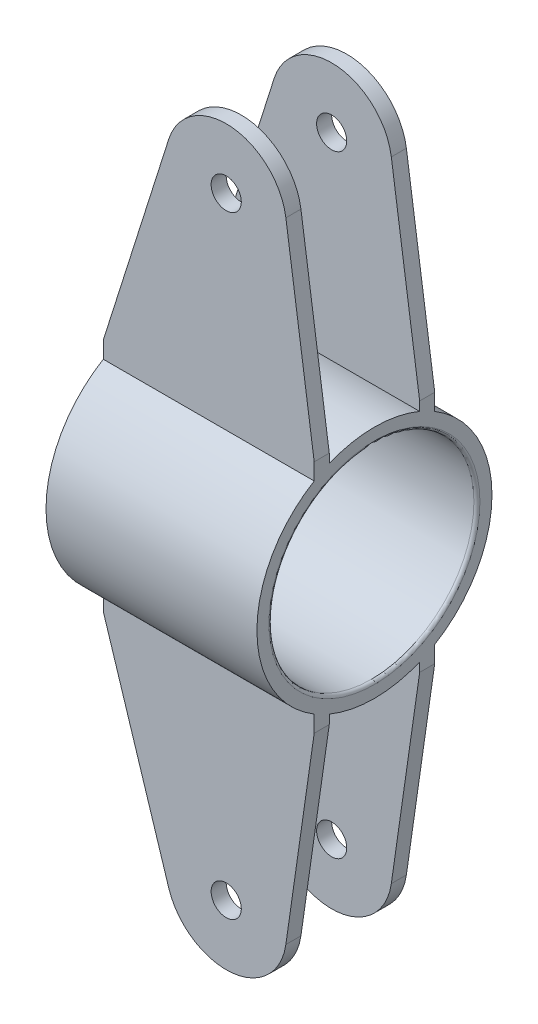
ISO-10303-21;
HEADER;
FILE_DESCRIPTION(('STEP AP214'),'2;1');
FILE_NAME('part.step','',(''),(''),'','','');
FILE_SCHEMA(('AUTOMOTIVE_DESIGN { 1 0 10303 214 1 1 1 1 }'));
ENDSEC;
DATA;
#1=APPLICATION_CONTEXT('core data for automotive mechanical design processes');
#2=APPLICATION_PROTOCOL_DEFINITION('international standard','automotive_design',2000,#1);
#3=PRODUCT_CONTEXT('',#1,'mechanical');
#4=PRODUCT('Part','Part','',(#3));
#5=PRODUCT_RELATED_PRODUCT_CATEGORY('part','',(#4));
#6=PRODUCT_DEFINITION_FORMATION('','',#4);
#7=PRODUCT_DEFINITION_CONTEXT('part definition',#1,'design');
#8=PRODUCT_DEFINITION('design','',#6,#7);
#9=PRODUCT_DEFINITION_SHAPE('','',#8);
#10=(LENGTH_UNIT() NAMED_UNIT(*) SI_UNIT(.MILLI.,.METRE.));
#11=(NAMED_UNIT(*) PLANE_ANGLE_UNIT() SI_UNIT($,.RADIAN.));
#12=(NAMED_UNIT(*) SI_UNIT($,.STERADIAN.) SOLID_ANGLE_UNIT());
#13=UNCERTAINTY_MEASURE_WITH_UNIT(LENGTH_MEASURE(1.E-05),#10,'distance_accuracy_value','');
#14=(GEOMETRIC_REPRESENTATION_CONTEXT(3) GLOBAL_UNCERTAINTY_ASSIGNED_CONTEXT((#13)) GLOBAL_UNIT_ASSIGNED_CONTEXT((#10,
#11,#12)) REPRESENTATION_CONTEXT('',''));
#15=CARTESIAN_POINT('',(0.,0.,0.));
#16=DIRECTION('',(0.,0.,1.));
#17=DIRECTION('',(1.,0.,0.));
#18=AXIS2_PLACEMENT_3D('',#15,#16,#17);
#19=CARTESIAN_POINT('',(35.,0.,0.));
#20=DIRECTION('',(-1.,0.,0.));
#21=DIRECTION('',(0.,0.,1.));
#22=AXIS2_PLACEMENT_3D('',#19,#20,#21);
#23=CYLINDRICAL_SURFACE('',#22,39.007);
#24=CARTESIAN_POINT('',(-21.9,0.,0.));
#25=DIRECTION('',(1.,0.,0.));
#26=DIRECTION('',(0.,0.,1.));
#27=AXIS2_PLACEMENT_3D('',#24,#25,#26);
#28=CIRCLE('',#27,39.007);
#29=CARTESIAN_POINT('',(-21.9,0.,-39.007));
#30=VERTEX_POINT('',#29);
#31=CARTESIAN_POINT('',(-21.9,33.4894916205069,-20.));
#32=VERTEX_POINT('',#31);
#33=EDGE_CURVE('E237',#30,#32,#28,.T.);
#34=ORIENTED_EDGE('',*,*,#33,.T.);
#35=DIRECTION('',(1.,0.,0.));
#36=VECTOR('',#35,1.);
#37=CARTESIAN_POINT('',(-42.4459988394961,33.4894916205069,-20.));
#38=LINE('',#37,#36);
#39=CARTESIAN_POINT('',(35.,33.4894916205069,-20.));
#40=VERTEX_POINT('',#39);
#41=EDGE_CURVE('E223',#32,#40,#38,.T.);
#42=ORIENTED_EDGE('',*,*,#41,.T.);
#43=CARTESIAN_POINT('',(35.,0.,0.));
#44=DIRECTION('',(1.,0.,0.));
#45=DIRECTION('',(0.,0.,-1.));
#46=AXIS2_PLACEMENT_3D('',#43,#44,#45);
#47=CIRCLE('',#46,39.007);
#48=CARTESIAN_POINT('',(35.,-33.4894916205069,-20.));
#49=VERTEX_POINT('',#48);
#50=EDGE_CURVE('E553',#49,#40,#47,.T.);
#51=ORIENTED_EDGE('',*,*,#50,.F.);
#52=DIRECTION('',(1.,0.,0.));
#53=VECTOR('',#52,1.);
#54=CARTESIAN_POINT('',(-42.4459988394961,-33.4894916205069,-20.));
#55=LINE('',#54,#53);
#56=CARTESIAN_POINT('',(-35.,-33.4894916205069,-20.));
#57=VERTEX_POINT('',#56);
#58=EDGE_CURVE('E546',#57,#49,#55,.T.);
#59=ORIENTED_EDGE('',*,*,#58,.F.);
#60=CARTESIAN_POINT('',(-35.,0.,0.));
#61=DIRECTION('',(1.,0.,0.));
#62=DIRECTION('',(0.,0.,-1.));
#63=AXIS2_PLACEMENT_3D('',#60,#61,#62);
#64=CIRCLE('',#63,39.007);
#65=CARTESIAN_POINT('',(-35.,33.4894916205069,-20.));
#66=VERTEX_POINT('',#65);
#67=EDGE_CURVE('E559',#57,#66,#64,.T.);
#68=ORIENTED_EDGE('',*,*,#67,.T.);
#69=CARTESIAN_POINT('',(-25.9,33.4894916205069,-20.));
#70=VERTEX_POINT('',#69);
#71=EDGE_CURVE('E234',#66,#70,#38,.T.);
#72=ORIENTED_EDGE('',*,*,#71,.T.);
#73=CARTESIAN_POINT('',(-25.9,0.,0.));
#74=DIRECTION('',(1.,0.,0.));
#75=DIRECTION('',(0.,0.,1.));
#76=AXIS2_PLACEMENT_3D('',#73,#74,#75);
#77=CIRCLE('',#76,39.007);
#78=CARTESIAN_POINT('',(-25.9,0.,-39.007));
#79=VERTEX_POINT('',#78);
#80=EDGE_CURVE('E59',#79,#70,#77,.T.);
#81=ORIENTED_EDGE('',*,*,#80,.F.);
#82=DIRECTION('',(-1.,0.,0.));
#83=VECTOR('',#82,1.);
#84=CARTESIAN_POINT('',(-21.9,0.,-39.007));
#85=LINE('',#84,#83);
#86=EDGE_CURVE('E54',#30,#79,#85,.T.);
#87=ORIENTED_EDGE('',*,*,#86,.F.);
#88=EDGE_LOOP('',(#34,#42,#51,#59,#68,#72,#81,#87));
#89=FACE_BOUND('',#88,.T.);
#90=ADVANCED_FACE('F38',(#89),#23,.T.);
#91=CARTESIAN_POINT('',(35.,33.4894916205069,20.));
#92=VERTEX_POINT('',#91);
#93=CARTESIAN_POINT('',(35.,-33.4894916205069,20.));
#94=VERTEX_POINT('',#93);
#95=EDGE_CURVE('E622',#92,#94,#47,.T.);
#96=ORIENTED_EDGE('',*,*,#95,.F.);
#97=DIRECTION('',(1.,0.,0.));
#98=VECTOR('',#97,1.);
#99=CARTESIAN_POINT('',(-42.4459988394961,33.4894916205069,20.));
#100=LINE('',#99,#98);
#101=CARTESIAN_POINT('',(-35.,33.4894916205069,20.));
#102=VERTEX_POINT('',#101);
#103=EDGE_CURVE('E410',#102,#92,#100,.T.);
#104=ORIENTED_EDGE('',*,*,#103,.F.);
#105=CARTESIAN_POINT('',(-35.,-33.4894916205069,20.));
#106=VERTEX_POINT('',#105);
#107=EDGE_CURVE('E661',#102,#106,#64,.T.);
#108=ORIENTED_EDGE('',*,*,#107,.T.);
#109=DIRECTION('',(1.,0.,0.));
#110=VECTOR('',#109,1.);
#111=CARTESIAN_POINT('',(-42.4459988394961,-33.4894916205069,20.));
#112=LINE('',#111,#110);
#113=EDGE_CURVE('E458',#106,#94,#112,.T.);
#114=ORIENTED_EDGE('',*,*,#113,.T.);
#115=EDGE_LOOP('',(#96,#104,#108,#114));
#116=FACE_BOUND('',#115,.T.);
#117=ADVANCED_FACE('F586',(#116),#23,.T.);
#118=CARTESIAN_POINT('',(35.,36.0075832152062,-15.));
#119=VERTEX_POINT('',#118);
#120=CARTESIAN_POINT('',(35.,36.0075832152062,15.));
#121=VERTEX_POINT('',#120);
#122=EDGE_CURVE('E557',#119,#121,#47,.T.);
#123=ORIENTED_EDGE('',*,*,#122,.F.);
#124=DIRECTION('',(1.,0.,0.));
#125=VECTOR('',#124,1.);
#126=CARTESIAN_POINT('',(-42.4459988394961,36.0075832152062,-15.));
#127=LINE('',#126,#125);
#128=CARTESIAN_POINT('',(-35.,36.0075832152062,-15.));
#129=VERTEX_POINT('',#128);
#130=EDGE_CURVE('E235',#129,#119,#127,.T.);
#131=ORIENTED_EDGE('',*,*,#130,.F.);
#132=CARTESIAN_POINT('',(-35.,36.0075832152062,15.));
#133=VERTEX_POINT('',#132);
#134=EDGE_CURVE('E562',#129,#133,#64,.T.);
#135=ORIENTED_EDGE('',*,*,#134,.T.);
#136=DIRECTION('',(1.,0.,0.));
#137=VECTOR('',#136,1.);
#138=CARTESIAN_POINT('',(-42.4459988394961,36.0075832152062,15.));
#139=LINE('',#138,#137);
#140=EDGE_CURVE('E390',#133,#121,#139,.T.);
#141=ORIENTED_EDGE('',*,*,#140,.T.);
#142=EDGE_LOOP('',(#123,#131,#135,#141));
#143=FACE_BOUND('',#142,.T.);
#144=ADVANCED_FACE('F592',(#143),#23,.T.);
#145=CARTESIAN_POINT('',(35.,0.,0.));
#146=DIRECTION('',(1.,0.,0.));
#147=DIRECTION('',(0.,0.,-1.));
#148=AXIS2_PLACEMENT_3D('',#145,#146,#147);
#149=PLANE('',#148);
#150=CARTESIAN_POINT('',(35.,0.,0.));
#151=DIRECTION('',(1.,0.,0.));
#152=DIRECTION('',(0.,0.,-1.));
#153=AXIS2_PLACEMENT_3D('',#150,#151,#152);
#154=CIRCLE('',#153,35.007);
#155=CARTESIAN_POINT('',(35.,0.,-35.007));
#156=VERTEX_POINT('',#155);
#157=EDGE_CURVE('E566',#156,#156,#154,.F.);
#158=ORIENTED_EDGE('',*,*,#157,.T.);
#159=EDGE_LOOP('',(#158));
#160=FACE_BOUND('',#159,.T.);
#161=ORIENTED_EDGE('',*,*,#50,.T.);
#162=DIRECTION('',(0.,1.,0.));
#163=VECTOR('',#162,1.);
#164=CARTESIAN_POINT('',(35.,39.007,-20.));
#165=LINE('',#164,#163);
#166=CARTESIAN_POINT('',(35.,39.007,-20.));
#167=VERTEX_POINT('',#166);
#168=EDGE_CURVE('E231',#40,#167,#165,.T.);
#169=ORIENTED_EDGE('',*,*,#168,.T.);
#170=DIRECTION('',(0.,0.,1.));
#171=VECTOR('',#170,1.);
#172=CARTESIAN_POINT('',(35.,39.007,-20.));
#173=LINE('',#172,#171);
#174=CARTESIAN_POINT('',(35.,39.007,-15.));
#175=VERTEX_POINT('',#174);
#176=EDGE_CURVE('E335',#167,#175,#173,.T.);
#177=ORIENTED_EDGE('',*,*,#176,.T.);
#178=DIRECTION('',(0.,-1.,0.));
#179=VECTOR('',#178,1.);
#180=CARTESIAN_POINT('',(35.,39.007,-15.));
#181=LINE('',#180,#179);
#182=EDGE_CURVE('E338',#175,#119,#181,.T.);
#183=ORIENTED_EDGE('',*,*,#182,.T.);
#184=ORIENTED_EDGE('',*,*,#122,.T.);
#185=DIRECTION('',(0.,1.,0.));
#186=VECTOR('',#185,1.);
#187=CARTESIAN_POINT('',(35.,39.007,15.));
#188=LINE('',#187,#186);
#189=CARTESIAN_POINT('',(35.,39.007,15.));
#190=VERTEX_POINT('',#189);
#191=EDGE_CURVE('E402',#121,#190,#188,.T.);
#192=ORIENTED_EDGE('',*,*,#191,.T.);
#193=DIRECTION('',(0.,0.,1.));
#194=VECTOR('',#193,1.);
#195=CARTESIAN_POINT('',(35.,39.007,20.));
#196=LINE('',#195,#194);
#197=CARTESIAN_POINT('',(35.,39.007,20.));
#198=VERTEX_POINT('',#197);
#199=EDGE_CURVE('E406',#190,#198,#196,.T.);
#200=ORIENTED_EDGE('',*,*,#199,.T.);
#201=DIRECTION('',(0.,-1.,0.));
#202=VECTOR('',#201,1.);
#203=CARTESIAN_POINT('',(35.,39.007,20.));
#204=LINE('',#203,#202);
#205=EDGE_CURVE('E384',#198,#92,#204,.T.);
#206=ORIENTED_EDGE('',*,*,#205,.T.);
#207=ORIENTED_EDGE('',*,*,#95,.T.);
#208=DIRECTION('',(0.,-1.,0.));
#209=VECTOR('',#208,1.);
#210=CARTESIAN_POINT('',(35.,-39.007,20.));
#211=LINE('',#210,#209);
#212=CARTESIAN_POINT('',(35.,-39.007,20.));
#213=VERTEX_POINT('',#212);
#214=EDGE_CURVE('E452',#94,#213,#211,.T.);
#215=ORIENTED_EDGE('',*,*,#214,.T.);
#216=DIRECTION('',(0.,0.,-1.));
#217=VECTOR('',#216,1.);
#218=CARTESIAN_POINT('',(35.,-39.007,20.));
#219=LINE('',#218,#217);
#220=CARTESIAN_POINT('',(35.,-39.007,15.));
#221=VERTEX_POINT('',#220);
#222=EDGE_CURVE('E466',#213,#221,#219,.T.);
#223=ORIENTED_EDGE('',*,*,#222,.T.);
#224=DIRECTION('',(0.,1.,0.));
#225=VECTOR('',#224,1.);
#226=CARTESIAN_POINT('',(35.,-39.007,15.));
#227=LINE('',#226,#225);
#228=CARTESIAN_POINT('',(35.,-36.0075832152062,15.));
#229=VERTEX_POINT('',#228);
#230=EDGE_CURVE('E470',#221,#229,#227,.T.);
#231=ORIENTED_EDGE('',*,*,#230,.T.);
#232=CARTESIAN_POINT('',(35.,-36.0075832152062,-15.));
#233=VERTEX_POINT('',#232);
#234=EDGE_CURVE('E558',#229,#233,#47,.T.);
#235=ORIENTED_EDGE('',*,*,#234,.T.);
#236=DIRECTION('',(0.,-1.,0.));
#237=VECTOR('',#236,1.);
#238=CARTESIAN_POINT('',(35.,-39.007,-15.));
#239=LINE('',#238,#237);
#240=CARTESIAN_POINT('',(35.,-39.007,-15.));
#241=VERTEX_POINT('',#240);
#242=EDGE_CURVE('E538',#233,#241,#239,.T.);
#243=ORIENTED_EDGE('',*,*,#242,.T.);
#244=DIRECTION('',(0.,0.,-1.));
#245=VECTOR('',#244,1.);
#246=CARTESIAN_POINT('',(35.,-39.007,-20.));
#247=LINE('',#246,#245);
#248=CARTESIAN_POINT('',(35.,-39.007,-20.));
#249=VERTEX_POINT('',#248);
#250=EDGE_CURVE('E542',#241,#249,#247,.T.);
#251=ORIENTED_EDGE('',*,*,#250,.T.);
#252=DIRECTION('',(0.,1.,0.));
#253=VECTOR('',#252,1.);
#254=CARTESIAN_POINT('',(35.,-39.007,-20.));
#255=LINE('',#254,#253);
#256=EDGE_CURVE('E518',#249,#49,#255,.T.);
#257=ORIENTED_EDGE('',*,*,#256,.T.);
#258=EDGE_LOOP('',(#161,#169,#177,#183,#184,#192,#200,#206,#207,#215,#223,#231,#235,#243,#251,#257));
#259=FACE_BOUND('',#258,.T.);
#260=ADVANCED_FACE('F607',(#160,#259),#149,.T.);
#261=CARTESIAN_POINT('',(-35.,0.,0.));
#262=DIRECTION('',(1.,0.,0.));
#263=DIRECTION('',(0.,0.,-1.));
#264=AXIS2_PLACEMENT_3D('',#261,#262,#263);
#265=PLANE('',#264);
#266=CARTESIAN_POINT('',(-35.,0.,0.));
#267=DIRECTION('',(1.,0.,0.));
#268=DIRECTION('',(0.,0.,-1.));
#269=AXIS2_PLACEMENT_3D('',#266,#267,#268);
#270=CIRCLE('',#269,35.007);
#271=CARTESIAN_POINT('',(-35.,0.,-35.007));
#272=VERTEX_POINT('',#271);
#273=EDGE_CURVE('E47',#272,#272,#270,.T.);
#274=ORIENTED_EDGE('',*,*,#273,.T.);
#275=EDGE_LOOP('',(#274));
#276=FACE_BOUND('',#275,.T.);
#277=ORIENTED_EDGE('',*,*,#67,.F.);
#278=DIRECTION('',(0.,-1.,0.));
#279=VECTOR('',#278,1.);
#280=CARTESIAN_POINT('',(-35.,-39.007,-20.));
#281=LINE('',#280,#279);
#282=CARTESIAN_POINT('',(-35.,-39.007,-20.));
#283=VERTEX_POINT('',#282);
#284=EDGE_CURVE('E530',#57,#283,#281,.T.);
#285=ORIENTED_EDGE('',*,*,#284,.T.);
#286=DIRECTION('',(0.,0.,1.));
#287=VECTOR('',#286,1.);
#288=CARTESIAN_POINT('',(-35.,-39.007,-20.));
#289=LINE('',#288,#287);
#290=CARTESIAN_POINT('',(-35.,-39.007,-15.));
#291=VERTEX_POINT('',#290);
#292=EDGE_CURVE('E525',#283,#291,#289,.T.);
#293=ORIENTED_EDGE('',*,*,#292,.T.);
#294=DIRECTION('',(0.,1.,0.));
#295=VECTOR('',#294,1.);
#296=CARTESIAN_POINT('',(-35.,-39.007,-15.));
#297=LINE('',#296,#295);
#298=CARTESIAN_POINT('',(-35.,-36.0075832152062,-15.));
#299=VERTEX_POINT('',#298);
#300=EDGE_CURVE('E521',#291,#299,#297,.T.);
#301=ORIENTED_EDGE('',*,*,#300,.T.);
#302=CARTESIAN_POINT('',(-35.,-36.0075832152062,15.));
#303=VERTEX_POINT('',#302);
#304=EDGE_CURVE('E534',#303,#299,#64,.T.);
#305=ORIENTED_EDGE('',*,*,#304,.F.);
#306=DIRECTION('',(0.,-1.,0.));
#307=VECTOR('',#306,1.);
#308=CARTESIAN_POINT('',(-35.,-39.007,15.));
#309=LINE('',#308,#307);
#310=CARTESIAN_POINT('',(-35.,-39.007,15.));
#311=VERTEX_POINT('',#310);
#312=EDGE_CURVE('E453',#303,#311,#309,.T.);
#313=ORIENTED_EDGE('',*,*,#312,.T.);
#314=DIRECTION('',(0.,0.,1.));
#315=VECTOR('',#314,1.);
#316=CARTESIAN_POINT('',(-35.,-39.007,20.));
#317=LINE('',#316,#315);
#318=CARTESIAN_POINT('',(-35.,-39.007,20.));
#319=VERTEX_POINT('',#318);
#320=EDGE_CURVE('E462',#311,#319,#317,.T.);
#321=ORIENTED_EDGE('',*,*,#320,.T.);
#322=DIRECTION('',(0.,1.,0.));
#323=VECTOR('',#322,1.);
#324=CARTESIAN_POINT('',(-35.,-39.007,20.));
#325=LINE('',#324,#323);
#326=EDGE_CURVE('E457',#319,#106,#325,.T.);
#327=ORIENTED_EDGE('',*,*,#326,.T.);
#328=ORIENTED_EDGE('',*,*,#107,.F.);
#329=DIRECTION('',(0.,1.,0.));
#330=VECTOR('',#329,1.);
#331=CARTESIAN_POINT('',(-35.,39.007,20.));
#332=LINE('',#331,#330);
#333=CARTESIAN_POINT('',(-35.,39.007,20.));
#334=VERTEX_POINT('',#333);
#335=EDGE_CURVE('E394',#102,#334,#332,.T.);
#336=ORIENTED_EDGE('',*,*,#335,.T.);
#337=DIRECTION('',(0.,0.,-1.));
#338=VECTOR('',#337,1.);
#339=CARTESIAN_POINT('',(-35.,39.007,20.));
#340=LINE('',#339,#338);
#341=CARTESIAN_POINT('',(-35.,39.007,15.));
#342=VERTEX_POINT('',#341);
#343=EDGE_CURVE('E389',#334,#342,#340,.T.);
#344=ORIENTED_EDGE('',*,*,#343,.T.);
#345=DIRECTION('',(0.,-1.,0.));
#346=VECTOR('',#345,1.);
#347=CARTESIAN_POINT('',(-35.,39.007,15.));
#348=LINE('',#347,#346);
#349=EDGE_CURVE('E385',#342,#133,#348,.T.);
#350=ORIENTED_EDGE('',*,*,#349,.T.);
#351=ORIENTED_EDGE('',*,*,#134,.F.);
#352=DIRECTION('',(0.,1.,0.));
#353=VECTOR('',#352,1.);
#354=CARTESIAN_POINT('',(-35.,39.007,-15.));
#355=LINE('',#354,#353);
#356=CARTESIAN_POINT('',(-35.,39.007,-15.));
#357=VERTEX_POINT('',#356);
#358=EDGE_CURVE('E325',#129,#357,#355,.T.);
#359=ORIENTED_EDGE('',*,*,#358,.T.);
#360=DIRECTION('',(0.,0.,-1.));
#361=VECTOR('',#360,1.);
#362=CARTESIAN_POINT('',(-35.,39.007,-20.));
#363=LINE('',#362,#361);
#364=CARTESIAN_POINT('',(-35.,39.007,-20.));
#365=VERTEX_POINT('',#364);
#366=EDGE_CURVE('E332',#357,#365,#363,.T.);
#367=ORIENTED_EDGE('',*,*,#366,.T.);
#368=DIRECTION('',(0.,-1.,0.));
#369=VECTOR('',#368,1.);
#370=CARTESIAN_POINT('',(-35.,39.007,-20.));
#371=LINE('',#370,#369);
#372=EDGE_CURVE('E328',#365,#66,#371,.T.);
#373=ORIENTED_EDGE('',*,*,#372,.T.);
#374=EDGE_LOOP('',(#277,#285,#293,#301,#305,#313,#321,#327,#328,#336,#344,#350,#351,#359,#367,#373));
#375=FACE_BOUND('',#374,.T.);
#376=ADVANCED_FACE('F573',(#276,#375),#265,.F.);
#377=ORIENTED_EDGE('',*,*,#234,.F.);
#378=DIRECTION('',(1.,0.,0.));
#379=VECTOR('',#378,1.);
#380=CARTESIAN_POINT('',(-42.4459988394961,-36.0075832152062,15.));
#381=LINE('',#380,#379);
#382=EDGE_CURVE('E474',#303,#229,#381,.T.);
#383=ORIENTED_EDGE('',*,*,#382,.F.);
#384=ORIENTED_EDGE('',*,*,#304,.T.);
#385=DIRECTION('',(1.,0.,0.));
#386=VECTOR('',#385,1.);
#387=CARTESIAN_POINT('',(-42.4459988394961,-36.0075832152062,-15.));
#388=LINE('',#387,#386);
#389=EDGE_CURVE('E526',#299,#233,#388,.T.);
#390=ORIENTED_EDGE('',*,*,#389,.T.);
#391=EDGE_LOOP('',(#377,#383,#384,#390));
#392=FACE_BOUND('',#391,.T.);
#393=ADVANCED_FACE('F588',(#392),#23,.T.);
#394=CARTESIAN_POINT('',(35.,0.,0.));
#395=DIRECTION('',(-1.,0.,0.));
#396=DIRECTION('',(0.,0.,1.));
#397=AXIS2_PLACEMENT_3D('',#394,#395,#396);
#398=CYLINDRICAL_SURFACE('',#397,34.007);
#399=CARTESIAN_POINT('',(-34.,0.,0.));
#400=DIRECTION('',(1.,0.,0.));
#401=DIRECTION('',(0.,0.,-1.));
#402=AXIS2_PLACEMENT_3D('',#399,#400,#401);
#403=CIRCLE('',#402,34.007);
#404=CARTESIAN_POINT('',(-34.,0.,-34.007));
#405=VERTEX_POINT('',#404);
#406=EDGE_CURVE('E11',#405,#405,#403,.F.);
#407=ORIENTED_EDGE('',*,*,#406,.T.);
#408=EDGE_LOOP('',(#407));
#409=FACE_BOUND('',#408,.T.);
#410=CARTESIAN_POINT('',(34.,0.,0.));
#411=DIRECTION('',(1.,0.,0.));
#412=DIRECTION('',(0.,0.,-1.));
#413=AXIS2_PLACEMENT_3D('',#410,#411,#412);
#414=CIRCLE('',#413,34.007);
#415=CARTESIAN_POINT('',(34.,0.,-34.007));
#416=VERTEX_POINT('',#415);
#417=EDGE_CURVE('E556',#416,#416,#414,.T.);
#418=ORIENTED_EDGE('',*,*,#417,.T.);
#419=EDGE_LOOP('',(#418));
#420=FACE_BOUND('',#419,.T.);
#421=ADVANCED_FACE('F596',(#409,#420),#398,.F.);
#422=CARTESIAN_POINT('',(-42.4459988394961,-39.007,-20.));
#423=DIRECTION('',(0.,0.,-1.));
#424=DIRECTION('',(-1.,0.,0.));
#425=AXIS2_PLACEMENT_3D('',#422,#423,#424);
#426=PLANE('',#425);
#427=ORIENTED_EDGE('',*,*,#284,.F.);
#428=ORIENTED_EDGE('',*,*,#58,.T.);
#429=ORIENTED_EDGE('',*,*,#256,.F.);
#430=DIRECTION('',(0.142238081932219,0.989832474739157,0.));
#431=VECTOR('',#430,1.);
#432=CARTESIAN_POINT('',(25.5966494947831,-104.444761638644,-20.));
#433=LINE('',#432,#431);
#434=CARTESIAN_POINT('',(25.5966494947831,-104.444761638644,-20.));
#435=VERTEX_POINT('',#434);
#436=EDGE_CURVE('E502',#435,#249,#433,.T.);
#437=ORIENTED_EDGE('',*,*,#436,.F.);
#438=CARTESIAN_POINT('',(5.8,-101.6,-20.));
#439=DIRECTION('',(0.,0.,1.));
#440=DIRECTION('',(1.,0.,0.));
#441=AXIS2_PLACEMENT_3D('',#438,#439,#440);
#442=CIRCLE('',#441,20.);
#443=CARTESIAN_POINT('',(-13.2668398670798,-107.637848746295,-20.));
#444=VERTEX_POINT('',#443);
#445=EDGE_CURVE('E497',#444,#435,#442,.T.);
#446=ORIENTED_EDGE('',*,*,#445,.F.);
#447=DIRECTION('',(0.301892437314758,-0.953341993353988,0.));
#448=VECTOR('',#447,1.);
#449=CARTESIAN_POINT('',(-35.,-39.007,-20.));
#450=LINE('',#449,#448);
#451=EDGE_CURVE('E493',#283,#444,#450,.T.);
#452=ORIENTED_EDGE('',*,*,#451,.F.);
#453=EDGE_LOOP('',(#427,#428,#429,#437,#446,#452));
#454=FACE_BOUND('',#453,.T.);
#455=CARTESIAN_POINT('',(5.8,-101.6,-20.));
#456=DIRECTION('',(0.,0.,1.));
#457=DIRECTION('',(1.,0.,0.));
#458=AXIS2_PLACEMENT_3D('',#455,#456,#457);
#459=CIRCLE('',#458,5.007);
#460=CARTESIAN_POINT('',(10.807,-101.6,-20.));
#461=VERTEX_POINT('',#460);
#462=EDGE_CURVE('E485',#461,#461,#459,.T.);
#463=ORIENTED_EDGE('',*,*,#462,.T.);
#464=EDGE_LOOP('',(#463));
#465=FACE_BOUND('',#464,.T.);
#466=ADVANCED_FACE('F603',(#454,#465),#426,.T.);
#467=CARTESIAN_POINT('',(-42.4459988394961,-39.007,-15.));
#468=DIRECTION('',(0.,0.,1.));
#469=DIRECTION('',(1.,0.,0.));
#470=AXIS2_PLACEMENT_3D('',#467,#468,#469);
#471=PLANE('',#470);
#472=ORIENTED_EDGE('',*,*,#300,.F.);
#473=DIRECTION('',(0.301892437314758,-0.953341993353988,0.));
#474=VECTOR('',#473,1.);
#475=CARTESIAN_POINT('',(-35.,-39.007,-15.));
#476=LINE('',#475,#474);
#477=CARTESIAN_POINT('',(-13.2668398670798,-107.637848746295,-15.));
#478=VERTEX_POINT('',#477);
#479=EDGE_CURVE('E489',#291,#478,#476,.T.);
#480=ORIENTED_EDGE('',*,*,#479,.T.);
#481=CARTESIAN_POINT('',(5.8,-101.6,-15.));
#482=DIRECTION('',(0.,0.,1.));
#483=DIRECTION('',(1.,0.,0.));
#484=AXIS2_PLACEMENT_3D('',#481,#482,#483);
#485=CIRCLE('',#484,20.);
#486=CARTESIAN_POINT('',(25.5966494947831,-104.444761638644,-15.));
#487=VERTEX_POINT('',#486);
#488=EDGE_CURVE('E509',#478,#487,#485,.T.);
#489=ORIENTED_EDGE('',*,*,#488,.T.);
#490=DIRECTION('',(0.142238081932219,0.989832474739157,0.));
#491=VECTOR('',#490,1.);
#492=CARTESIAN_POINT('',(25.5966494947831,-104.444761638644,-15.));
#493=LINE('',#492,#491);
#494=EDGE_CURVE('E498',#487,#241,#493,.T.);
#495=ORIENTED_EDGE('',*,*,#494,.T.);
#496=ORIENTED_EDGE('',*,*,#242,.F.);
#497=ORIENTED_EDGE('',*,*,#389,.F.);
#498=EDGE_LOOP('',(#472,#480,#489,#495,#496,#497));
#499=FACE_BOUND('',#498,.T.);
#500=CARTESIAN_POINT('',(5.8,-101.6,-15.));
#501=DIRECTION('',(0.,0.,1.));
#502=DIRECTION('',(1.,0.,0.));
#503=AXIS2_PLACEMENT_3D('',#500,#501,#502);
#504=CIRCLE('',#503,5.007);
#505=CARTESIAN_POINT('',(10.807,-101.6,-15.));
#506=VERTEX_POINT('',#505);
#507=EDGE_CURVE('E484',#506,#506,#504,.T.);
#508=ORIENTED_EDGE('',*,*,#507,.F.);
#509=EDGE_LOOP('',(#508));
#510=FACE_BOUND('',#509,.T.);
#511=ADVANCED_FACE('F653',(#499,#510),#471,.T.);
#512=CARTESIAN_POINT('',(25.5966494947831,-104.444761638644,-20.));
#513=DIRECTION('',(0.989832474739157,-0.142238081932219,0.));
#514=DIRECTION('',(0.142238081932219,0.989832474739157,0.));
#515=AXIS2_PLACEMENT_3D('',#512,#513,#514);
#516=PLANE('',#515);
#517=ORIENTED_EDGE('',*,*,#494,.F.);
#518=DIRECTION('',(0.,0.,1.));
#519=VECTOR('',#518,1.);
#520=CARTESIAN_POINT('',(25.5966494947831,-104.444761638644,-20.));
#521=LINE('',#520,#519);
#522=EDGE_CURVE('E515',#435,#487,#521,.T.);
#523=ORIENTED_EDGE('',*,*,#522,.F.);
#524=ORIENTED_EDGE('',*,*,#436,.T.);
#525=ORIENTED_EDGE('',*,*,#250,.F.);
#526=EDGE_LOOP('',(#517,#523,#524,#525));
#527=FACE_BOUND('',#526,.T.);
#528=ADVANCED_FACE('F738',(#527),#516,.T.);
#529=CARTESIAN_POINT('',(5.8,-101.6,-20.));
#530=DIRECTION('',(0.,0.,1.));
#531=DIRECTION('',(1.,0.,0.));
#532=AXIS2_PLACEMENT_3D('',#529,#530,#531);
#533=CYLINDRICAL_SURFACE('',#532,20.);
#534=ORIENTED_EDGE('',*,*,#488,.F.);
#535=DIRECTION('',(0.,0.,1.));
#536=VECTOR('',#535,1.);
#537=CARTESIAN_POINT('',(-13.2668398670798,-107.637848746295,-20.));
#538=LINE('',#537,#536);
#539=EDGE_CURVE('E505',#444,#478,#538,.T.);
#540=ORIENTED_EDGE('',*,*,#539,.F.);
#541=ORIENTED_EDGE('',*,*,#445,.T.);
#542=ORIENTED_EDGE('',*,*,#522,.T.);
#543=EDGE_LOOP('',(#534,#540,#541,#542));
#544=FACE_BOUND('',#543,.T.);
#545=ADVANCED_FACE('F741',(#544),#533,.T.);
#546=CARTESIAN_POINT('',(-35.,-39.007,-20.));
#547=DIRECTION('',(-0.953341993353988,-0.301892437314758,0.));
#548=DIRECTION('',(0.301892437314758,-0.953341993353988,0.));
#549=AXIS2_PLACEMENT_3D('',#546,#547,#548);
#550=PLANE('',#549);
#551=ORIENTED_EDGE('',*,*,#479,.F.);
#552=ORIENTED_EDGE('',*,*,#292,.F.);
#553=ORIENTED_EDGE('',*,*,#451,.T.);
#554=ORIENTED_EDGE('',*,*,#539,.T.);
#555=EDGE_LOOP('',(#551,#552,#553,#554));
#556=FACE_BOUND('',#555,.T.);
#557=ADVANCED_FACE('F650',(#556),#550,.T.);
#558=CARTESIAN_POINT('',(5.8,-101.6,-20.));
#559=DIRECTION('',(0.,0.,1.));
#560=DIRECTION('',(1.,0.,0.));
#561=AXIS2_PLACEMENT_3D('',#558,#559,#560);
#562=CYLINDRICAL_SURFACE('',#561,5.007);
#563=ORIENTED_EDGE('',*,*,#462,.F.);
#564=EDGE_LOOP('',(#563));
#565=FACE_BOUND('',#564,.T.);
#566=ORIENTED_EDGE('',*,*,#507,.T.);
#567=EDGE_LOOP('',(#566));
#568=FACE_BOUND('',#567,.T.);
#569=ADVANCED_FACE('F734',(#565,#568),#562,.F.);
#570=CARTESIAN_POINT('',(-42.4459988394961,-39.007,20.));
#571=DIRECTION('',(0.,0.,1.));
#572=DIRECTION('',(1.,0.,0.));
#573=AXIS2_PLACEMENT_3D('',#570,#571,#572);
#574=PLANE('',#573);
#575=ORIENTED_EDGE('',*,*,#326,.F.);
#576=DIRECTION('',(0.301892437314758,-0.953341993353988,0.));
#577=VECTOR('',#576,1.);
#578=CARTESIAN_POINT('',(-35.,-39.007,20.));
#579=LINE('',#578,#577);
#580=CARTESIAN_POINT('',(-13.2668398670798,-107.637848746295,20.));
#581=VERTEX_POINT('',#580);
#582=EDGE_CURVE('E425',#319,#581,#579,.T.);
#583=ORIENTED_EDGE('',*,*,#582,.T.);
#584=CARTESIAN_POINT('',(5.8,-101.6,20.));
#585=DIRECTION('',(0.,0.,1.));
#586=DIRECTION('',(1.,0.,0.));
#587=AXIS2_PLACEMENT_3D('',#584,#585,#586);
#588=CIRCLE('',#587,20.);
#589=CARTESIAN_POINT('',(25.5966494947831,-104.444761638644,20.));
#590=VERTEX_POINT('',#589);
#591=EDGE_CURVE('E429',#581,#590,#588,.T.);
#592=ORIENTED_EDGE('',*,*,#591,.T.);
#593=DIRECTION('',(0.142238081932219,0.989832474739157,0.));
#594=VECTOR('',#593,1.);
#595=CARTESIAN_POINT('',(35.,-39.007,20.));
#596=LINE('',#595,#594);
#597=EDGE_CURVE('E433',#590,#213,#596,.T.);
#598=ORIENTED_EDGE('',*,*,#597,.T.);
#599=ORIENTED_EDGE('',*,*,#214,.F.);
#600=ORIENTED_EDGE('',*,*,#113,.F.);
#601=EDGE_LOOP('',(#575,#583,#592,#598,#599,#600));
#602=FACE_BOUND('',#601,.T.);
#603=CARTESIAN_POINT('',(5.8,-101.6,20.));
#604=DIRECTION('',(0.,0.,1.));
#605=DIRECTION('',(1.,0.,0.));
#606=AXIS2_PLACEMENT_3D('',#603,#604,#605);
#607=CIRCLE('',#606,5.007);
#608=CARTESIAN_POINT('',(10.807,-101.6,20.));
#609=VERTEX_POINT('',#608);
#610=EDGE_CURVE('E417',#609,#609,#607,.T.);
#611=ORIENTED_EDGE('',*,*,#610,.F.);
#612=EDGE_LOOP('',(#611));
#613=FACE_BOUND('',#612,.T.);
#614=ADVANCED_FACE('F674',(#602,#613),#574,.T.);
#615=CARTESIAN_POINT('',(-42.4459988394961,-39.007,15.));
#616=DIRECTION('',(0.,0.,-1.));
#617=DIRECTION('',(-1.,0.,0.));
#618=AXIS2_PLACEMENT_3D('',#615,#616,#617);
#619=PLANE('',#618);
#620=ORIENTED_EDGE('',*,*,#312,.F.);
#621=ORIENTED_EDGE('',*,*,#382,.T.);
#622=ORIENTED_EDGE('',*,*,#230,.F.);
#623=DIRECTION('',(0.142238081932219,0.989832474739157,0.));
#624=VECTOR('',#623,1.);
#625=CARTESIAN_POINT('',(35.,-39.007,15.));
#626=LINE('',#625,#624);
#627=CARTESIAN_POINT('',(25.5966494947831,-104.444761638644,15.));
#628=VERTEX_POINT('',#627);
#629=EDGE_CURVE('E430',#628,#221,#626,.T.);
#630=ORIENTED_EDGE('',*,*,#629,.F.);
#631=CARTESIAN_POINT('',(5.8,-101.6,15.));
#632=DIRECTION('',(0.,0.,1.));
#633=DIRECTION('',(1.,0.,0.));
#634=AXIS2_PLACEMENT_3D('',#631,#632,#633);
#635=CIRCLE('',#634,20.);
#636=CARTESIAN_POINT('',(-13.2668398670798,-107.637848746295,15.));
#637=VERTEX_POINT('',#636);
#638=EDGE_CURVE('E440',#637,#628,#635,.T.);
#639=ORIENTED_EDGE('',*,*,#638,.F.);
#640=DIRECTION('',(0.301892437314758,-0.953341993353988,0.));
#641=VECTOR('',#640,1.);
#642=CARTESIAN_POINT('',(-35.,-39.007,15.));
#643=LINE('',#642,#641);
#644=EDGE_CURVE('E421',#311,#637,#643,.T.);
#645=ORIENTED_EDGE('',*,*,#644,.F.);
#646=EDGE_LOOP('',(#620,#621,#622,#630,#639,#645));
#647=FACE_BOUND('',#646,.T.);
#648=CARTESIAN_POINT('',(5.8,-101.6,15.));
#649=DIRECTION('',(0.,0.,1.));
#650=DIRECTION('',(1.,0.,0.));
#651=AXIS2_PLACEMENT_3D('',#648,#649,#650);
#652=CIRCLE('',#651,5.007);
#653=CARTESIAN_POINT('',(10.807,-101.6,15.));
#654=VERTEX_POINT('',#653);
#655=EDGE_CURVE('E398',#654,#654,#652,.T.);
#656=ORIENTED_EDGE('',*,*,#655,.T.);
#657=EDGE_LOOP('',(#656));
#658=FACE_BOUND('',#657,.T.);
#659=ADVANCED_FACE('F665',(#647,#658),#619,.T.);
#660=CARTESIAN_POINT('',(-35.,-39.007,20.));
#661=DIRECTION('',(0.953341993353988,0.301892437314758,0.));
#662=DIRECTION('',(-0.301892437314758,0.953341993353988,0.));
#663=AXIS2_PLACEMENT_3D('',#660,#661,#662);
#664=PLANE('',#663);
#665=ORIENTED_EDGE('',*,*,#644,.T.);
#666=DIRECTION('',(0.,0.,-1.));
#667=VECTOR('',#666,1.);
#668=CARTESIAN_POINT('',(-13.2668398670798,-107.637848746295,20.));
#669=LINE('',#668,#667);
#670=EDGE_CURVE('E448',#581,#637,#669,.T.);
#671=ORIENTED_EDGE('',*,*,#670,.F.);
#672=ORIENTED_EDGE('',*,*,#582,.F.);
#673=ORIENTED_EDGE('',*,*,#320,.F.);
#674=EDGE_LOOP('',(#665,#671,#672,#673));
#675=FACE_BOUND('',#674,.T.);
#676=ADVANCED_FACE('F670',(#675),#664,.F.);
#677=CARTESIAN_POINT('',(5.8,-101.6,20.));
#678=DIRECTION('',(0.,0.,-1.));
#679=DIRECTION('',(-1.,0.,0.));
#680=AXIS2_PLACEMENT_3D('',#677,#678,#679);
#681=CYLINDRICAL_SURFACE('',#680,20.);
#682=ORIENTED_EDGE('',*,*,#638,.T.);
#683=DIRECTION('',(0.,0.,-1.));
#684=VECTOR('',#683,1.);
#685=CARTESIAN_POINT('',(25.5966494947831,-104.444761638644,20.));
#686=LINE('',#685,#684);
#687=EDGE_CURVE('E436',#590,#628,#686,.T.);
#688=ORIENTED_EDGE('',*,*,#687,.F.);
#689=ORIENTED_EDGE('',*,*,#591,.F.);
#690=ORIENTED_EDGE('',*,*,#670,.T.);
#691=EDGE_LOOP('',(#682,#688,#689,#690));
#692=FACE_BOUND('',#691,.T.);
#693=ADVANCED_FACE('F723',(#692),#681,.T.);
#694=CARTESIAN_POINT('',(35.,-39.007,20.));
#695=DIRECTION('',(-0.989832474739157,0.142238081932219,0.));
#696=DIRECTION('',(-0.142238081932219,-0.989832474739157,0.));
#697=AXIS2_PLACEMENT_3D('',#694,#695,#696);
#698=PLANE('',#697);
#699=ORIENTED_EDGE('',*,*,#629,.T.);
#700=ORIENTED_EDGE('',*,*,#222,.F.);
#701=ORIENTED_EDGE('',*,*,#597,.F.);
#702=ORIENTED_EDGE('',*,*,#687,.T.);
#703=EDGE_LOOP('',(#699,#700,#701,#702));
#704=FACE_BOUND('',#703,.T.);
#705=ADVANCED_FACE('F719',(#704),#698,.F.);
#706=CARTESIAN_POINT('',(5.8,-101.6,20.));
#707=DIRECTION('',(0.,0.,-1.));
#708=DIRECTION('',(-1.,0.,0.));
#709=AXIS2_PLACEMENT_3D('',#706,#707,#708);
#710=CYLINDRICAL_SURFACE('',#709,5.007);
#711=ORIENTED_EDGE('',*,*,#610,.T.);
#712=EDGE_LOOP('',(#711));
#713=FACE_BOUND('',#712,.T.);
#714=ORIENTED_EDGE('',*,*,#655,.F.);
#715=EDGE_LOOP('',(#714));
#716=FACE_BOUND('',#715,.T.);
#717=ADVANCED_FACE('F716',(#713,#716),#710,.F.);
#718=CARTESIAN_POINT('',(-42.4459988394961,39.007,20.));
#719=DIRECTION('',(0.,0.,1.));
#720=DIRECTION('',(1.,0.,0.));
#721=AXIS2_PLACEMENT_3D('',#718,#719,#720);
#722=PLANE('',#721);
#723=ORIENTED_EDGE('',*,*,#335,.F.);
#724=ORIENTED_EDGE('',*,*,#103,.T.);
#725=ORIENTED_EDGE('',*,*,#205,.F.);
#726=DIRECTION('',(-0.14223808193222,0.989832474739157,0.));
#727=VECTOR('',#726,1.);
#728=CARTESIAN_POINT('',(35.,39.007,20.));
#729=LINE('',#728,#727);
#730=CARTESIAN_POINT('',(25.5966494947831,104.444761638644,20.));
#731=VERTEX_POINT('',#730);
#732=EDGE_CURVE('E357',#198,#731,#729,.T.);
#733=ORIENTED_EDGE('',*,*,#732,.T.);
#734=CARTESIAN_POINT('',(5.79999999999994,101.6,20.));
#735=DIRECTION('',(0.,0.,1.));
#736=DIRECTION('',(1.,0.,0.));
#737=AXIS2_PLACEMENT_3D('',#734,#735,#736);
#738=CIRCLE('',#737,20.);
#739=CARTESIAN_POINT('',(-13.2668398670798,107.637848746295,20.));
#740=VERTEX_POINT('',#739);
#741=EDGE_CURVE('E361',#731,#740,#738,.T.);
#742=ORIENTED_EDGE('',*,*,#741,.T.);
#743=DIRECTION('',(-0.301892437314758,-0.953341993353988,0.));
#744=VECTOR('',#743,1.);
#745=CARTESIAN_POINT('',(-35.,39.007,20.));
#746=LINE('',#745,#744);
#747=EDGE_CURVE('E365',#740,#334,#746,.T.);
#748=ORIENTED_EDGE('',*,*,#747,.T.);
#749=EDGE_LOOP('',(#723,#724,#725,#733,#742,#748));
#750=FACE_BOUND('',#749,.T.);
#751=CARTESIAN_POINT('',(5.79999999999994,101.6,20.));
#752=DIRECTION('',(0.,0.,1.));
#753=DIRECTION('',(1.,0.,0.));
#754=AXIS2_PLACEMENT_3D('',#751,#752,#753);
#755=CIRCLE('',#754,5.007);
#756=CARTESIAN_POINT('',(10.8069999999999,101.6,20.));
#757=VERTEX_POINT('',#756);
#758=EDGE_CURVE('E349',#757,#757,#755,.T.);
#759=ORIENTED_EDGE('',*,*,#758,.F.);
#760=EDGE_LOOP('',(#759));
#761=FACE_BOUND('',#760,.T.);
#762=ADVANCED_FACE('F693',(#750,#761),#722,.T.);
#763=CARTESIAN_POINT('',(-42.4459988394961,39.007,15.));
#764=DIRECTION('',(0.,0.,-1.));
#765=DIRECTION('',(-1.,0.,0.));
#766=AXIS2_PLACEMENT_3D('',#763,#764,#765);
#767=PLANE('',#766);
#768=ORIENTED_EDGE('',*,*,#349,.F.);
#769=DIRECTION('',(-0.301892437314758,-0.953341993353988,0.));
#770=VECTOR('',#769,1.);
#771=CARTESIAN_POINT('',(-35.,39.007,15.));
#772=LINE('',#771,#770);
#773=CARTESIAN_POINT('',(-13.2668398670798,107.637848746295,15.));
#774=VERTEX_POINT('',#773);
#775=EDGE_CURVE('E362',#774,#342,#772,.T.);
#776=ORIENTED_EDGE('',*,*,#775,.F.);
#777=CARTESIAN_POINT('',(5.79999999999994,101.6,15.));
#778=DIRECTION('',(0.,0.,1.));
#779=DIRECTION('',(1.,0.,0.));
#780=AXIS2_PLACEMENT_3D('',#777,#778,#779);
#781=CIRCLE('',#780,20.);
#782=CARTESIAN_POINT('',(25.5966494947831,104.444761638644,15.));
#783=VERTEX_POINT('',#782);
#784=EDGE_CURVE('E372',#783,#774,#781,.T.);
#785=ORIENTED_EDGE('',*,*,#784,.F.);
#786=DIRECTION('',(-0.14223808193222,0.989832474739157,0.));
#787=VECTOR('',#786,1.);
#788=CARTESIAN_POINT('',(35.,39.007,15.));
#789=LINE('',#788,#787);
#790=EDGE_CURVE('E353',#190,#783,#789,.T.);
#791=ORIENTED_EDGE('',*,*,#790,.F.);
#792=ORIENTED_EDGE('',*,*,#191,.F.);
#793=ORIENTED_EDGE('',*,*,#140,.F.);
#794=EDGE_LOOP('',(#768,#776,#785,#791,#792,#793));
#795=FACE_BOUND('',#794,.T.);
#796=CARTESIAN_POINT('',(5.79999999999994,101.6,15.));
#797=DIRECTION('',(0.,0.,1.));
#798=DIRECTION('',(1.,0.,0.));
#799=AXIS2_PLACEMENT_3D('',#796,#797,#798);
#800=CIRCLE('',#799,5.007);
#801=CARTESIAN_POINT('',(10.8069999999999,101.6,15.));
#802=VERTEX_POINT('',#801);
#803=EDGE_CURVE('E348',#802,#802,#800,.T.);
#804=ORIENTED_EDGE('',*,*,#803,.T.);
#805=EDGE_LOOP('',(#804));
#806=FACE_BOUND('',#805,.T.);
#807=ADVANCED_FACE('F685',(#795,#806),#767,.T.);
#808=CARTESIAN_POINT('',(35.,39.007,20.));
#809=DIRECTION('',(-0.989832474739157,-0.14223808193222,0.));
#810=DIRECTION('',(0.14223808193222,-0.989832474739157,0.));
#811=AXIS2_PLACEMENT_3D('',#808,#809,#810);
#812=PLANE('',#811);
#813=ORIENTED_EDGE('',*,*,#790,.T.);
#814=DIRECTION('',(0.,0.,-1.));
#815=VECTOR('',#814,1.);
#816=CARTESIAN_POINT('',(25.5966494947831,104.444761638644,20.));
#817=LINE('',#816,#815);
#818=EDGE_CURVE('E380',#731,#783,#817,.T.);
#819=ORIENTED_EDGE('',*,*,#818,.F.);
#820=ORIENTED_EDGE('',*,*,#732,.F.);
#821=ORIENTED_EDGE('',*,*,#199,.F.);
#822=EDGE_LOOP('',(#813,#819,#820,#821));
#823=FACE_BOUND('',#822,.T.);
#824=ADVANCED_FACE('F690',(#823),#812,.F.);
#825=CARTESIAN_POINT('',(5.79999999999994,101.6,20.));
#826=DIRECTION('',(0.,0.,-1.));
#827=DIRECTION('',(-1.,0.,0.));
#828=AXIS2_PLACEMENT_3D('',#825,#826,#827);
#829=CYLINDRICAL_SURFACE('',#828,20.);
#830=ORIENTED_EDGE('',*,*,#784,.T.);
#831=DIRECTION('',(0.,0.,-1.));
#832=VECTOR('',#831,1.);
#833=CARTESIAN_POINT('',(-13.2668398670798,107.637848746295,20.));
#834=LINE('',#833,#832);
#835=EDGE_CURVE('E368',#740,#774,#834,.T.);
#836=ORIENTED_EDGE('',*,*,#835,.F.);
#837=ORIENTED_EDGE('',*,*,#741,.F.);
#838=ORIENTED_EDGE('',*,*,#818,.T.);
#839=EDGE_LOOP('',(#830,#836,#837,#838));
#840=FACE_BOUND('',#839,.T.);
#841=ADVANCED_FACE('F700',(#840),#829,.T.);
#842=CARTESIAN_POINT('',(-35.,39.007,20.));
#843=DIRECTION('',(0.953341993353988,-0.301892437314758,0.));
#844=DIRECTION('',(0.301892437314758,0.953341993353988,0.));
#845=AXIS2_PLACEMENT_3D('',#842,#843,#844);
#846=PLANE('',#845);
#847=ORIENTED_EDGE('',*,*,#775,.T.);
#848=ORIENTED_EDGE('',*,*,#343,.F.);
#849=ORIENTED_EDGE('',*,*,#747,.F.);
#850=ORIENTED_EDGE('',*,*,#835,.T.);
#851=EDGE_LOOP('',(#847,#848,#849,#850));
#852=FACE_BOUND('',#851,.T.);
#853=ADVANCED_FACE('F698',(#852),#846,.F.);
#854=CARTESIAN_POINT('',(5.79999999999994,101.6,20.));
#855=DIRECTION('',(0.,0.,-1.));
#856=DIRECTION('',(-1.,0.,0.));
#857=AXIS2_PLACEMENT_3D('',#854,#855,#856);
#858=CYLINDRICAL_SURFACE('',#857,5.007);
#859=ORIENTED_EDGE('',*,*,#758,.T.);
#860=EDGE_LOOP('',(#859));
#861=FACE_BOUND('',#860,.T.);
#862=ORIENTED_EDGE('',*,*,#803,.F.);
#863=EDGE_LOOP('',(#862));
#864=FACE_BOUND('',#863,.T.);
#865=ADVANCED_FACE('F707',(#861,#864),#858,.F.);
#866=CARTESIAN_POINT('',(-42.4459988394961,39.007,-20.));
#867=DIRECTION('',(0.,0.,-1.));
#868=DIRECTION('',(-1.,0.,0.));
#869=AXIS2_PLACEMENT_3D('',#866,#867,#868);
#870=PLANE('',#869);
#871=ORIENTED_EDGE('',*,*,#372,.F.);
#872=DIRECTION('',(-0.301892437314758,-0.953341993353988,0.));
#873=VECTOR('',#872,1.);
#874=CARTESIAN_POINT('',(-13.2668398670798,107.637848746295,-20.));
#875=LINE('',#874,#873);
#876=CARTESIAN_POINT('',(-13.2668398670798,107.637848746295,-20.));
#877=VERTEX_POINT('',#876);
#878=EDGE_CURVE('E296',#877,#365,#875,.T.);
#879=ORIENTED_EDGE('',*,*,#878,.F.);
#880=CARTESIAN_POINT('',(5.79999999999994,101.6,-20.));
#881=DIRECTION('',(0.,0.,1.));
#882=DIRECTION('',(1.,0.,0.));
#883=AXIS2_PLACEMENT_3D('',#880,#881,#882);
#884=CIRCLE('',#883,20.);
#885=CARTESIAN_POINT('',(25.5966494947831,104.444761638644,-20.));
#886=VERTEX_POINT('',#885);
#887=EDGE_CURVE('E305',#886,#877,#884,.T.);
#888=ORIENTED_EDGE('',*,*,#887,.F.);
#889=DIRECTION('',(-0.14223808193222,0.989832474739157,0.));
#890=VECTOR('',#889,1.);
#891=CARTESIAN_POINT('',(35.,39.007,-20.));
#892=LINE('',#891,#890);
#893=EDGE_CURVE('E300',#167,#886,#892,.T.);
#894=ORIENTED_EDGE('',*,*,#893,.F.);
#895=ORIENTED_EDGE('',*,*,#168,.F.);
#896=ORIENTED_EDGE('',*,*,#41,.F.);
#897=DIRECTION('',(-1.,0.,0.));
#898=VECTOR('',#897,1.);
#899=CARTESIAN_POINT('',(-21.9,33.4894916205069,-20.));
#900=LINE('',#899,#898);
#901=EDGE_CURVE('E229',#32,#70,#900,.T.);
#902=ORIENTED_EDGE('',*,*,#901,.T.);
#903=ORIENTED_EDGE('',*,*,#71,.F.);
#904=EDGE_LOOP('',(#871,#879,#888,#894,#895,#896,#902,#903));
#905=FACE_BOUND('',#904,.T.);
#906=CARTESIAN_POINT('',(5.79999999999994,101.6,-20.));
#907=DIRECTION('',(0.,0.,1.));
#908=DIRECTION('',(1.,0.,0.));
#909=AXIS2_PLACEMENT_3D('',#906,#907,#908);
#910=CIRCLE('',#909,5.007);
#911=CARTESIAN_POINT('',(10.8069999999999,101.6,-20.));
#912=VERTEX_POINT('',#911);
#913=EDGE_CURVE('E288',#912,#912,#910,.T.);
#914=ORIENTED_EDGE('',*,*,#913,.T.);
#915=EDGE_LOOP('',(#914));
#916=FACE_BOUND('',#915,.T.);
#917=ADVANCED_FACE('F225',(#905,#916),#870,.T.);
#918=CARTESIAN_POINT('',(-42.4459988394961,39.007,-15.));
#919=DIRECTION('',(0.,0.,1.));
#920=DIRECTION('',(1.,0.,0.));
#921=AXIS2_PLACEMENT_3D('',#918,#919,#920);
#922=PLANE('',#921);
#923=ORIENTED_EDGE('',*,*,#358,.F.);
#924=ORIENTED_EDGE('',*,*,#130,.T.);
#925=ORIENTED_EDGE('',*,*,#182,.F.);
#926=DIRECTION('',(-0.14223808193222,0.989832474739157,0.));
#927=VECTOR('',#926,1.);
#928=CARTESIAN_POINT('',(35.,39.007,-15.));
#929=LINE('',#928,#927);
#930=CARTESIAN_POINT('',(25.5966494947831,104.444761638644,-15.));
#931=VERTEX_POINT('',#930);
#932=EDGE_CURVE('E313',#175,#931,#929,.T.);
#933=ORIENTED_EDGE('',*,*,#932,.T.);
#934=CARTESIAN_POINT('',(5.79999999999994,101.6,-15.));
#935=DIRECTION('',(0.,0.,1.));
#936=DIRECTION('',(1.,0.,0.));
#937=AXIS2_PLACEMENT_3D('',#934,#935,#936);
#938=CIRCLE('',#937,20.);
#939=CARTESIAN_POINT('',(-13.2668398670798,107.637848746295,-15.));
#940=VERTEX_POINT('',#939);
#941=EDGE_CURVE('E301',#931,#940,#938,.T.);
#942=ORIENTED_EDGE('',*,*,#941,.T.);
#943=DIRECTION('',(-0.301892437314758,-0.953341993353988,0.));
#944=VECTOR('',#943,1.);
#945=CARTESIAN_POINT('',(-13.2668398670798,107.637848746295,-15.));
#946=LINE('',#945,#944);
#947=EDGE_CURVE('E292',#940,#357,#946,.T.);
#948=ORIENTED_EDGE('',*,*,#947,.T.);
#949=EDGE_LOOP('',(#923,#924,#925,#933,#942,#948));
#950=FACE_BOUND('',#949,.T.);
#951=CARTESIAN_POINT('',(5.79999999999994,101.6,-15.));
#952=DIRECTION('',(0.,0.,1.));
#953=DIRECTION('',(1.,0.,0.));
#954=AXIS2_PLACEMENT_3D('',#951,#952,#953);
#955=CIRCLE('',#954,5.007);
#956=CARTESIAN_POINT('',(10.8069999999999,101.6,-15.));
#957=VERTEX_POINT('',#956);
#958=EDGE_CURVE('E282',#957,#957,#955,.T.);
#959=ORIENTED_EDGE('',*,*,#958,.F.);
#960=EDGE_LOOP('',(#959));
#961=FACE_BOUND('',#960,.T.);
#962=ADVANCED_FACE('F625',(#950,#961),#922,.T.);
#963=CARTESIAN_POINT('',(-13.2668398670798,107.637848746295,-20.));
#964=DIRECTION('',(-0.953341993353988,0.301892437314758,0.));
#965=DIRECTION('',(-0.301892437314758,-0.953341993353988,0.));
#966=AXIS2_PLACEMENT_3D('',#963,#964,#965);
#967=PLANE('',#966);
#968=ORIENTED_EDGE('',*,*,#947,.F.);
#969=DIRECTION('',(0.,0.,1.));
#970=VECTOR('',#969,1.);
#971=CARTESIAN_POINT('',(-13.2668398670798,107.637848746295,-20.));
#972=LINE('',#971,#970);
#973=EDGE_CURVE('E320',#877,#940,#972,.T.);
#974=ORIENTED_EDGE('',*,*,#973,.F.);
#975=ORIENTED_EDGE('',*,*,#878,.T.);
#976=ORIENTED_EDGE('',*,*,#366,.F.);
#977=EDGE_LOOP('',(#968,#974,#975,#976));
#978=FACE_BOUND('',#977,.T.);
#979=ADVANCED_FACE('F639',(#978),#967,.T.);
#980=CARTESIAN_POINT('',(5.79999999999994,101.6,-20.));
#981=DIRECTION('',(0.,0.,1.));
#982=DIRECTION('',(1.,0.,0.));
#983=AXIS2_PLACEMENT_3D('',#980,#981,#982);
#984=CYLINDRICAL_SURFACE('',#983,20.);
#985=ORIENTED_EDGE('',*,*,#941,.F.);
#986=DIRECTION('',(0.,0.,1.));
#987=VECTOR('',#986,1.);
#988=CARTESIAN_POINT('',(25.5966494947831,104.444761638644,-20.));
#989=LINE('',#988,#987);
#990=EDGE_CURVE('E309',#886,#931,#989,.T.);
#991=ORIENTED_EDGE('',*,*,#990,.F.);
#992=ORIENTED_EDGE('',*,*,#887,.T.);
#993=ORIENTED_EDGE('',*,*,#973,.T.);
#994=EDGE_LOOP('',(#985,#991,#992,#993));
#995=FACE_BOUND('',#994,.T.);
#996=ADVANCED_FACE('F635',(#995),#984,.T.);
#997=CARTESIAN_POINT('',(35.,39.007,-20.));
#998=DIRECTION('',(0.989832474739157,0.14223808193222,0.));
#999=DIRECTION('',(-0.14223808193222,0.989832474739157,0.));
#1000=AXIS2_PLACEMENT_3D('',#997,#998,#999);
#1001=PLANE('',#1000);
#1002=ORIENTED_EDGE('',*,*,#932,.F.);
#1003=ORIENTED_EDGE('',*,*,#176,.F.);
#1004=ORIENTED_EDGE('',*,*,#893,.T.);
#1005=ORIENTED_EDGE('',*,*,#990,.T.);
#1006=EDGE_LOOP('',(#1002,#1003,#1004,#1005));
#1007=FACE_BOUND('',#1006,.T.);
#1008=ADVANCED_FACE('F630',(#1007),#1001,.T.);
#1009=CARTESIAN_POINT('',(5.79999999999994,101.6,-20.));
#1010=DIRECTION('',(0.,0.,1.));
#1011=DIRECTION('',(1.,0.,0.));
#1012=AXIS2_PLACEMENT_3D('',#1009,#1010,#1011);
#1013=CYLINDRICAL_SURFACE('',#1012,5.007);
#1014=ORIENTED_EDGE('',*,*,#913,.F.);
#1015=EDGE_LOOP('',(#1014));
#1016=FACE_BOUND('',#1015,.T.);
#1017=ORIENTED_EDGE('',*,*,#958,.T.);
#1018=EDGE_LOOP('',(#1017));
#1019=FACE_BOUND('',#1018,.T.);
#1020=ADVANCED_FACE('F869',(#1016,#1019),#1013,.F.);
#1021=CARTESIAN_POINT('',(-21.9,0.,-39.007));
#1022=DIRECTION('',(0.,-0.496540108034621,-0.868013779333581));
#1023=DIRECTION('',(0.,0.868013779333581,-0.496540108034621));
#1024=AXIS2_PLACEMENT_3D('',#1021,#1022,#1023);
#1025=PLANE('',#1024);
#1026=DIRECTION('',(0.,-0.868013779333581,0.496540108034621));
#1027=VECTOR('',#1026,1.);
#1028=CARTESIAN_POINT('',(-25.9,0.,-39.007));
#1029=LINE('',#1028,#1027);
#1030=CARTESIAN_POINT('',(-25.9,45.703054903242,-65.1510548058936));
#1031=VERTEX_POINT('',#1030);
#1032=EDGE_CURVE('E244',#1031,#79,#1029,.T.);
#1033=ORIENTED_EDGE('',*,*,#1032,.F.);
#1034=DIRECTION('',(-1.,0.,0.));
#1035=VECTOR('',#1034,1.);
#1036=CARTESIAN_POINT('',(-21.9,45.703054903242,-65.1510548058936));
#1037=LINE('',#1036,#1035);
#1038=CARTESIAN_POINT('',(-21.9,45.703054903242,-65.1510548058936));
#1039=VERTEX_POINT('',#1038);
#1040=EDGE_CURVE('E283',#1039,#1031,#1037,.T.);
#1041=ORIENTED_EDGE('',*,*,#1040,.F.);
#1042=DIRECTION('',(0.,-0.868013779333581,0.496540108034621));
#1043=VECTOR('',#1042,1.);
#1044=CARTESIAN_POINT('',(-21.9,0.,-39.007));
#1045=LINE('',#1044,#1043);
#1046=EDGE_CURVE('E254',#1039,#30,#1045,.T.);
#1047=ORIENTED_EDGE('',*,*,#1046,.T.);
#1048=ORIENTED_EDGE('',*,*,#86,.T.);
#1049=EDGE_LOOP('',(#1033,#1041,#1047,#1048));
#1050=FACE_BOUND('',#1049,.T.);
#1051=ADVANCED_FACE('F877',(#1050),#1025,.T.);
#1052=CARTESIAN_POINT('',(-21.9,50.6684559835882,-56.4709170125578));
#1053=DIRECTION('',(-1.,0.,0.));
#1054=DIRECTION('',(0.,0.,1.));
#1055=AXIS2_PLACEMENT_3D('',#1052,#1053,#1054);
#1056=CYLINDRICAL_SURFACE('',#1055,10.);
#1057=CARTESIAN_POINT('',(-25.9,50.6684559835882,-56.4709170125578));
#1058=DIRECTION('',(-1.,0.,0.));
#1059=DIRECTION('',(0.,0.,1.));
#1060=AXIS2_PLACEMENT_3D('',#1057,#1058,#1059);
#1061=CIRCLE('',#1060,10.);
#1062=CARTESIAN_POINT('',(-25.9,58.37535381501,-50.0988117234068));
#1063=VERTEX_POINT('',#1062);
#1064=EDGE_CURVE('E273',#1063,#1031,#1061,.T.);
#1065=ORIENTED_EDGE('',*,*,#1064,.F.);
#1066=DIRECTION('',(-1.,0.,0.));
#1067=VECTOR('',#1066,1.);
#1068=CARTESIAN_POINT('',(-21.9,58.37535381501,-50.0988117234068));
#1069=LINE('',#1068,#1067);
#1070=CARTESIAN_POINT('',(-21.9,58.37535381501,-50.0988117234068));
#1071=VERTEX_POINT('',#1070);
#1072=EDGE_CURVE('E253',#1071,#1063,#1069,.T.);
#1073=ORIENTED_EDGE('',*,*,#1072,.F.);
#1074=CARTESIAN_POINT('',(-21.9,50.6684559835882,-56.4709170125578));
#1075=DIRECTION('',(-1.,0.,0.));
#1076=DIRECTION('',(0.,0.,1.));
#1077=AXIS2_PLACEMENT_3D('',#1074,#1075,#1076);
#1078=CIRCLE('',#1077,10.);
#1079=EDGE_CURVE('E259',#1071,#1039,#1078,.T.);
#1080=ORIENTED_EDGE('',*,*,#1079,.T.);
#1081=ORIENTED_EDGE('',*,*,#1040,.T.);
#1082=EDGE_LOOP('',(#1065,#1073,#1080,#1081));
#1083=FACE_BOUND('',#1082,.T.);
#1084=ADVANCED_FACE('F898',(#1083),#1056,.T.);
#1085=CARTESIAN_POINT('',(-21.9,33.4894916205069,-20.));
#1086=DIRECTION('',(0.,0.770689783142184,0.637210528915094));
#1087=DIRECTION('',(0.,-0.637210528915094,0.770689783142184));
#1088=AXIS2_PLACEMENT_3D('',#1085,#1086,#1087);
#1089=PLANE('',#1088);
#1090=DIRECTION('',(0.,0.637210528915094,-0.770689783142184));
#1091=VECTOR('',#1090,1.);
#1092=CARTESIAN_POINT('',(-25.9,33.4894916205069,-20.));
#1093=LINE('',#1092,#1091);
#1094=EDGE_CURVE('E251',#70,#1063,#1093,.T.);
#1095=ORIENTED_EDGE('',*,*,#1094,.F.);
#1096=ORIENTED_EDGE('',*,*,#901,.F.);
#1097=DIRECTION('',(0.,0.637210528915094,-0.770689783142184));
#1098=VECTOR('',#1097,1.);
#1099=CARTESIAN_POINT('',(-21.9,33.4894916205069,-20.));
#1100=LINE('',#1099,#1098);
#1101=EDGE_CURVE('E243',#32,#1071,#1100,.T.);
#1102=ORIENTED_EDGE('',*,*,#1101,.T.);
#1103=ORIENTED_EDGE('',*,*,#1072,.T.);
#1104=EDGE_LOOP('',(#1095,#1096,#1102,#1103));
#1105=FACE_BOUND('',#1104,.T.);
#1106=ADVANCED_FACE('F249',(#1105),#1089,.T.);
#1107=CARTESIAN_POINT('',(-21.9,0.,0.));
#1108=DIRECTION('',(-1.,0.,0.));
#1109=DIRECTION('',(0.,0.,1.));
#1110=AXIS2_PLACEMENT_3D('',#1107,#1108,#1109);
#1111=PLANE('',#1110);
#1112=CARTESIAN_POINT('',(-21.9,50.6684559835882,-56.4709170125578));
#1113=DIRECTION('',(-1.,0.,0.));
#1114=DIRECTION('',(0.,0.,1.));
#1115=AXIS2_PLACEMENT_3D('',#1112,#1113,#1114);
#1116=CIRCLE('',#1115,3.);
#1117=CARTESIAN_POINT('',(-21.9,50.6684559835882,-53.4709170125578));
#1118=VERTEX_POINT('',#1117);
#1119=EDGE_CURVE('E270',#1118,#1118,#1116,.T.);
#1120=ORIENTED_EDGE('',*,*,#1119,.T.);
#1121=EDGE_LOOP('',(#1120));
#1122=FACE_BOUND('',#1121,.T.);
#1123=ORIENTED_EDGE('',*,*,#33,.F.);
#1124=ORIENTED_EDGE('',*,*,#1046,.F.);
#1125=ORIENTED_EDGE('',*,*,#1079,.F.);
#1126=ORIENTED_EDGE('',*,*,#1101,.F.);
#1127=EDGE_LOOP('',(#1123,#1124,#1125,#1126));
#1128=FACE_BOUND('',#1127,.T.);
#1129=ADVANCED_FACE('F257',(#1122,#1128),#1111,.F.);
#1130=CARTESIAN_POINT('',(-25.9,0.,0.));
#1131=DIRECTION('',(-1.,0.,0.));
#1132=DIRECTION('',(0.,0.,1.));
#1133=AXIS2_PLACEMENT_3D('',#1130,#1131,#1132);
#1134=PLANE('',#1133);
#1135=CARTESIAN_POINT('',(-25.9,50.6684559835882,-56.4709170125578));
#1136=DIRECTION('',(-1.,0.,0.));
#1137=DIRECTION('',(0.,0.,1.));
#1138=AXIS2_PLACEMENT_3D('',#1135,#1136,#1137);
#1139=CIRCLE('',#1138,3.);
#1140=CARTESIAN_POINT('',(-25.9,50.6684559835882,-53.4709170125578));
#1141=VERTEX_POINT('',#1140);
#1142=EDGE_CURVE('E1061',#1141,#1141,#1139,.T.);
#1143=ORIENTED_EDGE('',*,*,#1142,.F.);
#1144=EDGE_LOOP('',(#1143));
#1145=FACE_BOUND('',#1144,.T.);
#1146=ORIENTED_EDGE('',*,*,#80,.T.);
#1147=ORIENTED_EDGE('',*,*,#1094,.T.);
#1148=ORIENTED_EDGE('',*,*,#1064,.T.);
#1149=ORIENTED_EDGE('',*,*,#1032,.T.);
#1150=EDGE_LOOP('',(#1146,#1147,#1148,#1149));
#1151=FACE_BOUND('',#1150,.T.);
#1152=ADVANCED_FACE('F925',(#1145,#1151),#1134,.T.);
#1153=CARTESIAN_POINT('',(-21.9,50.6684559835882,-56.4709170125578));
#1154=DIRECTION('',(-1.,0.,0.));
#1155=DIRECTION('',(0.,0.,1.));
#1156=AXIS2_PLACEMENT_3D('',#1153,#1154,#1155);
#1157=CYLINDRICAL_SURFACE('',#1156,3.);
#1158=ORIENTED_EDGE('',*,*,#1119,.F.);
#1159=EDGE_LOOP('',(#1158));
#1160=FACE_BOUND('',#1159,.T.);
#1161=ORIENTED_EDGE('',*,*,#1142,.T.);
#1162=EDGE_LOOP('',(#1161));
#1163=FACE_BOUND('',#1162,.T.);
#1164=ADVANCED_FACE('F582',(#1160,#1163),#1157,.F.);
#1165=CARTESIAN_POINT('',(34.,0.,0.));
#1166=DIRECTION('',(1.,0.,0.));
#1167=DIRECTION('',(0.,0.,-1.));
#1168=AXIS2_PLACEMENT_3D('',#1165,#1166,#1167);
#1169=TOROIDAL_SURFACE('',#1168,35.007,1.);
#1170=ORIENTED_EDGE('',*,*,#157,.F.);
#1171=EDGE_LOOP('',(#1170));
#1172=FACE_BOUND('',#1171,.T.);
#1173=ORIENTED_EDGE('',*,*,#417,.F.);
#1174=EDGE_LOOP('',(#1173));
#1175=FACE_BOUND('',#1174,.T.);
#1176=ADVANCED_FACE('F577',(#1172,#1175),#1169,.T.);
#1177=CARTESIAN_POINT('',(-34.,0.,0.));
#1178=DIRECTION('',(1.,0.,0.));
#1179=DIRECTION('',(0.,0.,-1.));
#1180=AXIS2_PLACEMENT_3D('',#1177,#1178,#1179);
#1181=TOROIDAL_SURFACE('',#1180,35.007,1.);
#1182=ORIENTED_EDGE('',*,*,#406,.F.);
#1183=EDGE_LOOP('',(#1182));
#1184=FACE_BOUND('',#1183,.T.);
#1185=ORIENTED_EDGE('',*,*,#273,.F.);
#1186=EDGE_LOOP('',(#1185));
#1187=FACE_BOUND('',#1186,.T.);
#1188=ADVANCED_FACE('F40',(#1184,#1187),#1181,.T.);
#1189=CLOSED_SHELL('',(#90,#117,#144,#260,#376,#393,#421,#466,#511,#528,#545,#557,#569,#614,
#659,#676,#693,#705,#717,#762,#807,#824,#841,#853,#865,#917,#962,#979,#996,#1008,#1020,#1051,
#1084,#1106,#1129,#1152,#1164,#1176,#1188));
#1190=MANIFOLD_SOLID_BREP('B2',#1189);
#1191=ADVANCED_BREP_SHAPE_REPRESENTATION('',(#18,#1190),#14);
#1192=SHAPE_DEFINITION_REPRESENTATION(#9,#1191);
ENDSEC;
END-ISO-10303-21;
